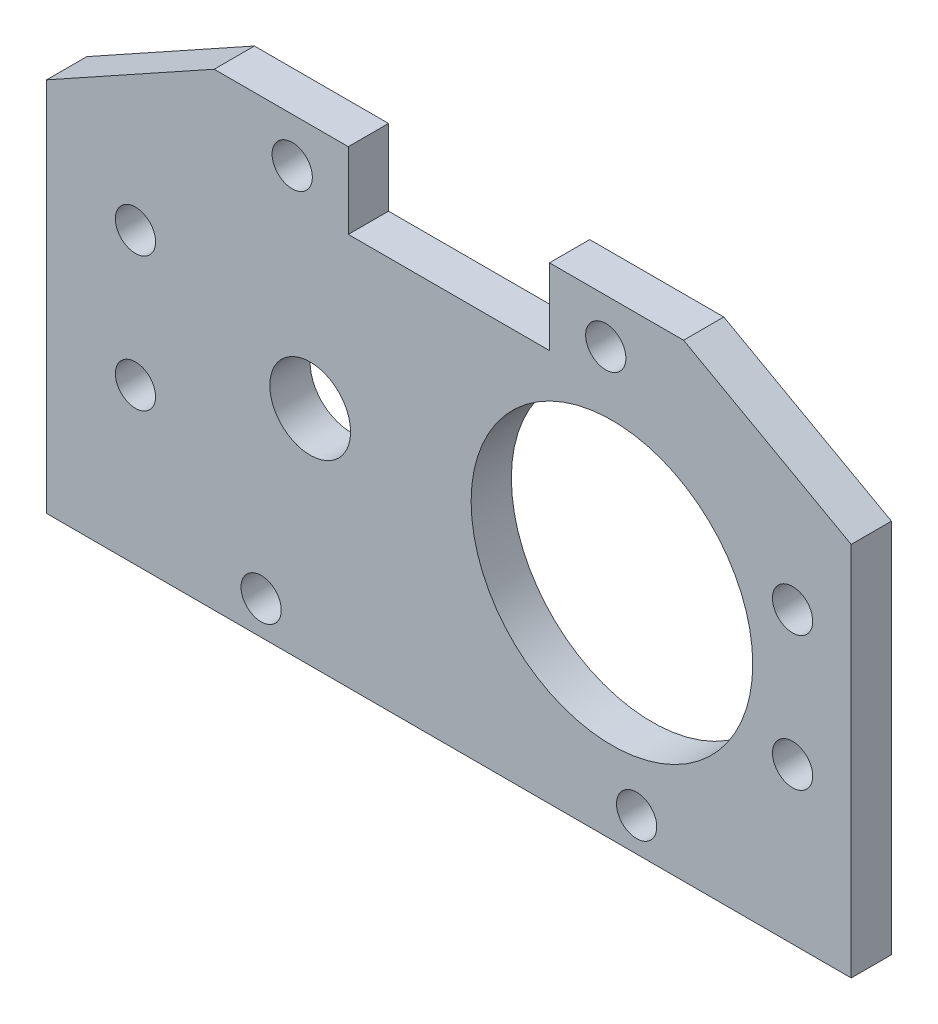
ISO-10303-21;
HEADER;
FILE_DESCRIPTION(('STEP AP214'),'2;1');
FILE_NAME('part.step','',(''),(''),'','','');
FILE_SCHEMA(('AUTOMOTIVE_DESIGN { 1 0 10303 214 1 1 1 1 }'));
ENDSEC;
DATA;
#1=APPLICATION_CONTEXT('core data for automotive mechanical design processes');
#2=APPLICATION_PROTOCOL_DEFINITION('international standard','automotive_design',2000,#1);
#3=PRODUCT_CONTEXT('',#1,'mechanical');
#4=PRODUCT('Part','Part','',(#3));
#5=PRODUCT_RELATED_PRODUCT_CATEGORY('part','',(#4));
#6=PRODUCT_DEFINITION_FORMATION('','',#4);
#7=PRODUCT_DEFINITION_CONTEXT('part definition',#1,'design');
#8=PRODUCT_DEFINITION('design','',#6,#7);
#9=PRODUCT_DEFINITION_SHAPE('','',#8);
#10=(LENGTH_UNIT() NAMED_UNIT(*) SI_UNIT(.MILLI.,.METRE.));
#11=(NAMED_UNIT(*) PLANE_ANGLE_UNIT() SI_UNIT($,.RADIAN.));
#12=(NAMED_UNIT(*) SI_UNIT($,.STERADIAN.) SOLID_ANGLE_UNIT());
#13=UNCERTAINTY_MEASURE_WITH_UNIT(LENGTH_MEASURE(1.E-05),#10,'distance_accuracy_value','');
#14=(GEOMETRIC_REPRESENTATION_CONTEXT(3) GLOBAL_UNCERTAINTY_ASSIGNED_CONTEXT((#13)) GLOBAL_UNIT_ASSIGNED_CONTEXT((#10,
#11,#12)) REPRESENTATION_CONTEXT('',''));
#15=CARTESIAN_POINT('',(0.,0.,0.));
#16=DIRECTION('',(0.,0.,1.));
#17=DIRECTION('',(1.,0.,0.));
#18=AXIS2_PLACEMENT_3D('',#15,#16,#17);
#19=CARTESIAN_POINT('',(7.5,0.,3.));
#20=DIRECTION('',(1.,0.,0.));
#21=DIRECTION('',(0.,0.,-1.));
#22=AXIS2_PLACEMENT_3D('',#19,#20,#21);
#23=PLANE('',#22);
#24=DIRECTION('',(0.,-1.,0.));
#25=VECTOR('',#24,1.);
#26=CARTESIAN_POINT('',(7.5,0.,0.));
#27=LINE('',#26,#25);
#28=CARTESIAN_POINT('',(7.5,5.66583768810425,0.));
#29=VERTEX_POINT('',#28);
#30=CARTESIAN_POINT('',(7.5,0.,0.));
#31=VERTEX_POINT('',#30);
#32=EDGE_CURVE('E142',#29,#31,#27,.T.);
#33=ORIENTED_EDGE('',*,*,#32,.T.);
#34=DIRECTION('',(0.,0.,-1.));
#35=VECTOR('',#34,1.);
#36=CARTESIAN_POINT('',(7.5,0.,3.));
#37=LINE('',#36,#35);
#38=CARTESIAN_POINT('',(7.5,0.,3.));
#39=VERTEX_POINT('',#38);
#40=EDGE_CURVE('E11',#39,#31,#37,.T.);
#41=ORIENTED_EDGE('',*,*,#40,.F.);
#42=DIRECTION('',(0.,-1.,0.));
#43=VECTOR('',#42,1.);
#44=CARTESIAN_POINT('',(7.5,0.,3.));
#45=LINE('',#44,#43);
#46=CARTESIAN_POINT('',(7.5,5.66583768810425,3.));
#47=VERTEX_POINT('',#46);
#48=EDGE_CURVE('E161',#47,#39,#45,.T.);
#49=ORIENTED_EDGE('',*,*,#48,.F.);
#50=DIRECTION('',(0.,0.,-1.));
#51=VECTOR('',#50,1.);
#52=CARTESIAN_POINT('',(7.5,5.66583768810425,3.));
#53=LINE('',#52,#51);
#54=EDGE_CURVE('E138',#47,#29,#53,.T.);
#55=ORIENTED_EDGE('',*,*,#54,.T.);
#56=EDGE_LOOP('',(#33,#41,#49,#55));
#57=FACE_BOUND('',#56,.T.);
#58=ADVANCED_FACE('F34',(#57),#23,.F.);
#59=CARTESIAN_POINT('',(-7.5,0.,3.));
#60=DIRECTION('',(0.,-1.,0.));
#61=DIRECTION('',(0.,0.,-1.));
#62=AXIS2_PLACEMENT_3D('',#59,#60,#61);
#63=PLANE('',#62);
#64=DIRECTION('',(-1.,0.,0.));
#65=VECTOR('',#64,1.);
#66=CARTESIAN_POINT('',(-7.5,0.,0.));
#67=LINE('',#66,#65);
#68=CARTESIAN_POINT('',(-7.5,0.,0.));
#69=VERTEX_POINT('',#68);
#70=EDGE_CURVE('E145',#31,#69,#67,.T.);
#71=ORIENTED_EDGE('',*,*,#70,.T.);
#72=DIRECTION('',(0.,0.,-1.));
#73=VECTOR('',#72,1.);
#74=CARTESIAN_POINT('',(-7.5,0.,3.));
#75=LINE('',#74,#73);
#76=CARTESIAN_POINT('',(-7.5,0.,3.));
#77=VERTEX_POINT('',#76);
#78=EDGE_CURVE('E42',#77,#69,#75,.T.);
#79=ORIENTED_EDGE('',*,*,#78,.F.);
#80=DIRECTION('',(-1.,0.,0.));
#81=VECTOR('',#80,1.);
#82=CARTESIAN_POINT('',(-7.5,0.,3.));
#83=LINE('',#82,#81);
#84=EDGE_CURVE('E99',#39,#77,#83,.T.);
#85=ORIENTED_EDGE('',*,*,#84,.F.);
#86=ORIENTED_EDGE('',*,*,#40,.T.);
#87=EDGE_LOOP('',(#71,#79,#85,#86));
#88=FACE_BOUND('',#87,.T.);
#89=ADVANCED_FACE('F314',(#88),#63,.F.);
#90=CARTESIAN_POINT('',(-7.5,0.,3.));
#91=DIRECTION('',(-1.,0.,0.));
#92=DIRECTION('',(0.,0.,1.));
#93=AXIS2_PLACEMENT_3D('',#90,#91,#92);
#94=PLANE('',#93);
#95=DIRECTION('',(0.,1.,0.));
#96=VECTOR('',#95,1.);
#97=CARTESIAN_POINT('',(-7.5,0.,0.));
#98=LINE('',#97,#96);
#99=CARTESIAN_POINT('',(-7.5,5.66583768810425,0.));
#100=VERTEX_POINT('',#99);
#101=EDGE_CURVE('E148',#69,#100,#98,.T.);
#102=ORIENTED_EDGE('',*,*,#101,.T.);
#103=DIRECTION('',(0.,0.,-1.));
#104=VECTOR('',#103,1.);
#105=CARTESIAN_POINT('',(-7.5,5.66583768810425,3.));
#106=LINE('',#105,#104);
#107=CARTESIAN_POINT('',(-7.5,5.66583768810425,3.));
#108=VERTEX_POINT('',#107);
#109=EDGE_CURVE('E174',#108,#100,#106,.T.);
#110=ORIENTED_EDGE('',*,*,#109,.F.);
#111=DIRECTION('',(0.,1.,0.));
#112=VECTOR('',#111,1.);
#113=CARTESIAN_POINT('',(-7.5,0.,3.));
#114=LINE('',#113,#112);
#115=EDGE_CURVE('E182',#77,#108,#114,.T.);
#116=ORIENTED_EDGE('',*,*,#115,.F.);
#117=ORIENTED_EDGE('',*,*,#78,.T.);
#118=EDGE_LOOP('',(#102,#110,#116,#117));
#119=FACE_BOUND('',#118,.T.);
#120=ADVANCED_FACE('F180',(#119),#94,.F.);
#121=CARTESIAN_POINT('',(-7.5,5.66583768810425,3.));
#122=DIRECTION('',(0.,-1.,0.));
#123=DIRECTION('',(1.,0.,0.));
#124=AXIS2_PLACEMENT_3D('',#121,#122,#123);
#125=PLANE('',#124);
#126=DIRECTION('',(-1.,0.,0.));
#127=VECTOR('',#126,1.);
#128=CARTESIAN_POINT('',(-7.5,5.66583768810425,0.));
#129=LINE('',#128,#127);
#130=CARTESIAN_POINT('',(-17.5,5.66583768810424,0.));
#131=VERTEX_POINT('',#130);
#132=EDGE_CURVE('E150',#100,#131,#129,.T.);
#133=ORIENTED_EDGE('',*,*,#132,.T.);
#134=DIRECTION('',(0.,0.,-1.));
#135=VECTOR('',#134,1.);
#136=CARTESIAN_POINT('',(-17.5,5.66583768810424,3.));
#137=LINE('',#136,#135);
#138=CARTESIAN_POINT('',(-17.5,5.66583768810424,3.));
#139=VERTEX_POINT('',#138);
#140=EDGE_CURVE('E171',#139,#131,#137,.T.);
#141=ORIENTED_EDGE('',*,*,#140,.F.);
#142=DIRECTION('',(-1.,0.,0.));
#143=VECTOR('',#142,1.);
#144=CARTESIAN_POINT('',(-7.5,5.66583768810425,3.));
#145=LINE('',#144,#143);
#146=EDGE_CURVE('E200',#108,#139,#145,.T.);
#147=ORIENTED_EDGE('',*,*,#146,.F.);
#148=ORIENTED_EDGE('',*,*,#109,.T.);
#149=EDGE_LOOP('',(#133,#141,#147,#148));
#150=FACE_BOUND('',#149,.T.);
#151=ADVANCED_FACE('F191',(#150),#125,.F.);
#152=CARTESIAN_POINT('',(-17.5,5.66583768810424,3.));
#153=DIRECTION('',(0.485146223738787,-0.874433040084828,0.));
#154=DIRECTION('',(0.874433040084828,0.485146223738787,0.));
#155=AXIS2_PLACEMENT_3D('',#152,#153,#154);
#156=PLANE('',#155);
#157=DIRECTION('',(-0.874433040084828,-0.485146223738787,0.));
#158=VECTOR('',#157,1.);
#159=CARTESIAN_POINT('',(-17.5,5.66583768810424,0.));
#160=LINE('',#159,#158);
#161=CARTESIAN_POINT('',(-30.,-1.26931631310612,0.));
#162=VERTEX_POINT('',#161);
#163=EDGE_CURVE('E152',#131,#162,#160,.T.);
#164=ORIENTED_EDGE('',*,*,#163,.T.);
#165=DIRECTION('',(0.,0.,-1.));
#166=VECTOR('',#165,1.);
#167=CARTESIAN_POINT('',(-30.,-1.26931631310612,3.));
#168=LINE('',#167,#166);
#169=CARTESIAN_POINT('',(-30.,-1.26931631310612,3.));
#170=VERTEX_POINT('',#169);
#171=EDGE_CURVE('E168',#170,#162,#168,.T.);
#172=ORIENTED_EDGE('',*,*,#171,.F.);
#173=DIRECTION('',(-0.874433040084828,-0.485146223738787,0.));
#174=VECTOR('',#173,1.);
#175=CARTESIAN_POINT('',(-17.5,5.66583768810424,3.));
#176=LINE('',#175,#174);
#177=EDGE_CURVE('E197',#139,#170,#176,.T.);
#178=ORIENTED_EDGE('',*,*,#177,.F.);
#179=ORIENTED_EDGE('',*,*,#140,.T.);
#180=EDGE_LOOP('',(#164,#172,#178,#179));
#181=FACE_BOUND('',#180,.T.);
#182=ADVANCED_FACE('F195',(#181),#156,.F.);
#183=CARTESIAN_POINT('',(-30.,-1.26931631310612,3.));
#184=DIRECTION('',(1.,0.,0.));
#185=DIRECTION('',(0.,1.,0.));
#186=AXIS2_PLACEMENT_3D('',#183,#184,#185);
#187=PLANE('',#186);
#188=DIRECTION('',(0.,-1.,0.));
#189=VECTOR('',#188,1.);
#190=CARTESIAN_POINT('',(-30.,-1.26931631310612,0.));
#191=LINE('',#190,#189);
#192=CARTESIAN_POINT('',(-30.,-29.2693163131061,0.));
#193=VERTEX_POINT('',#192);
#194=EDGE_CURVE('E154',#162,#193,#191,.T.);
#195=ORIENTED_EDGE('',*,*,#194,.T.);
#196=DIRECTION('',(0.,0.,-1.));
#197=VECTOR('',#196,1.);
#198=CARTESIAN_POINT('',(-30.,-29.2693163131061,3.));
#199=LINE('',#198,#197);
#200=CARTESIAN_POINT('',(-30.,-29.2693163131061,3.));
#201=VERTEX_POINT('',#200);
#202=EDGE_CURVE('E165',#201,#193,#199,.T.);
#203=ORIENTED_EDGE('',*,*,#202,.F.);
#204=DIRECTION('',(0.,-1.,0.));
#205=VECTOR('',#204,1.);
#206=CARTESIAN_POINT('',(-30.,-1.26931631310612,3.));
#207=LINE('',#206,#205);
#208=EDGE_CURVE('E199',#170,#201,#207,.T.);
#209=ORIENTED_EDGE('',*,*,#208,.F.);
#210=ORIENTED_EDGE('',*,*,#171,.T.);
#211=EDGE_LOOP('',(#195,#203,#209,#210));
#212=FACE_BOUND('',#211,.T.);
#213=ADVANCED_FACE('F326',(#212),#187,.F.);
#214=CARTESIAN_POINT('',(30.,-29.2693163131061,3.));
#215=DIRECTION('',(0.,1.,0.));
#216=DIRECTION('',(-1.,0.,0.));
#217=AXIS2_PLACEMENT_3D('',#214,#215,#216);
#218=PLANE('',#217);
#219=DIRECTION('',(1.,0.,0.));
#220=VECTOR('',#219,1.);
#221=CARTESIAN_POINT('',(30.,-29.2693163131061,0.));
#222=LINE('',#221,#220);
#223=CARTESIAN_POINT('',(30.,-29.2693163131061,0.));
#224=VERTEX_POINT('',#223);
#225=EDGE_CURVE('E156',#193,#224,#222,.T.);
#226=ORIENTED_EDGE('',*,*,#225,.T.);
#227=DIRECTION('',(0.,0.,-1.));
#228=VECTOR('',#227,1.);
#229=CARTESIAN_POINT('',(30.,-29.2693163131061,3.));
#230=LINE('',#229,#228);
#231=CARTESIAN_POINT('',(30.,-29.2693163131061,3.));
#232=VERTEX_POINT('',#231);
#233=EDGE_CURVE('E133',#232,#224,#230,.T.);
#234=ORIENTED_EDGE('',*,*,#233,.F.);
#235=DIRECTION('',(1.,0.,0.));
#236=VECTOR('',#235,1.);
#237=CARTESIAN_POINT('',(30.,-29.2693163131061,3.));
#238=LINE('',#237,#236);
#239=EDGE_CURVE('E124',#201,#232,#238,.T.);
#240=ORIENTED_EDGE('',*,*,#239,.F.);
#241=ORIENTED_EDGE('',*,*,#202,.T.);
#242=EDGE_LOOP('',(#226,#234,#240,#241));
#243=FACE_BOUND('',#242,.T.);
#244=ADVANCED_FACE('F323',(#243),#218,.F.);
#245=CARTESIAN_POINT('',(30.,-1.26931631310611,3.));
#246=DIRECTION('',(-1.,0.,0.));
#247=DIRECTION('',(0.,-1.,0.));
#248=AXIS2_PLACEMENT_3D('',#245,#246,#247);
#249=PLANE('',#248);
#250=DIRECTION('',(0.,1.,0.));
#251=VECTOR('',#250,1.);
#252=CARTESIAN_POINT('',(30.,-1.26931631310611,0.));
#253=LINE('',#252,#251);
#254=CARTESIAN_POINT('',(30.,-1.26931631310611,0.));
#255=VERTEX_POINT('',#254);
#256=EDGE_CURVE('E132',#224,#255,#253,.T.);
#257=ORIENTED_EDGE('',*,*,#256,.T.);
#258=DIRECTION('',(0.,0.,-1.));
#259=VECTOR('',#258,1.);
#260=CARTESIAN_POINT('',(30.,-1.26931631310611,3.));
#261=LINE('',#260,#259);
#262=CARTESIAN_POINT('',(30.,-1.26931631310611,3.));
#263=VERTEX_POINT('',#262);
#264=EDGE_CURVE('E129',#263,#255,#261,.T.);
#265=ORIENTED_EDGE('',*,*,#264,.F.);
#266=DIRECTION('',(0.,1.,0.));
#267=VECTOR('',#266,1.);
#268=CARTESIAN_POINT('',(30.,-1.26931631310611,3.));
#269=LINE('',#268,#267);
#270=EDGE_CURVE('E118',#232,#263,#269,.T.);
#271=ORIENTED_EDGE('',*,*,#270,.F.);
#272=ORIENTED_EDGE('',*,*,#233,.T.);
#273=EDGE_LOOP('',(#257,#265,#271,#272));
#274=FACE_BOUND('',#273,.T.);
#275=ADVANCED_FACE('F130',(#274),#249,.F.);
#276=CARTESIAN_POINT('',(17.5,5.66583768810425,3.));
#277=DIRECTION('',(-0.485146223738787,-0.874433040084828,0.));
#278=DIRECTION('',(0.874433040084828,-0.485146223738787,0.));
#279=AXIS2_PLACEMENT_3D('',#276,#277,#278);
#280=PLANE('',#279);
#281=DIRECTION('',(-0.874433040084828,0.485146223738787,0.));
#282=VECTOR('',#281,1.);
#283=CARTESIAN_POINT('',(17.5,5.66583768810425,0.));
#284=LINE('',#283,#282);
#285=CARTESIAN_POINT('',(17.5,5.66583768810425,0.));
#286=VERTEX_POINT('',#285);
#287=EDGE_CURVE('E85',#255,#286,#284,.T.);
#288=ORIENTED_EDGE('',*,*,#287,.T.);
#289=DIRECTION('',(0.,0.,-1.));
#290=VECTOR('',#289,1.);
#291=CARTESIAN_POINT('',(17.5,5.66583768810425,3.));
#292=LINE('',#291,#290);
#293=CARTESIAN_POINT('',(17.5,5.66583768810425,3.));
#294=VERTEX_POINT('',#293);
#295=EDGE_CURVE('E134',#294,#286,#292,.T.);
#296=ORIENTED_EDGE('',*,*,#295,.F.);
#297=DIRECTION('',(-0.874433040084828,0.485146223738787,0.));
#298=VECTOR('',#297,1.);
#299=CARTESIAN_POINT('',(17.5,5.66583768810425,3.));
#300=LINE('',#299,#298);
#301=EDGE_CURVE('E122',#263,#294,#300,.T.);
#302=ORIENTED_EDGE('',*,*,#301,.F.);
#303=ORIENTED_EDGE('',*,*,#264,.T.);
#304=EDGE_LOOP('',(#288,#296,#302,#303));
#305=FACE_BOUND('',#304,.T.);
#306=ADVANCED_FACE('F136',(#305),#280,.F.);
#307=CARTESIAN_POINT('',(7.5,5.66583768810425,3.));
#308=DIRECTION('',(0.,-1.,0.));
#309=DIRECTION('',(0.,0.,-1.));
#310=AXIS2_PLACEMENT_3D('',#307,#308,#309);
#311=PLANE('',#310);
#312=DIRECTION('',(-1.,0.,0.));
#313=VECTOR('',#312,1.);
#314=CARTESIAN_POINT('',(7.5,5.66583768810425,0.));
#315=LINE('',#314,#313);
#316=EDGE_CURVE('E91',#286,#29,#315,.T.);
#317=ORIENTED_EDGE('',*,*,#316,.T.);
#318=ORIENTED_EDGE('',*,*,#54,.F.);
#319=DIRECTION('',(-1.,0.,0.));
#320=VECTOR('',#319,1.);
#321=CARTESIAN_POINT('',(7.5,5.66583768810425,3.));
#322=LINE('',#321,#320);
#323=EDGE_CURVE('E50',#294,#47,#322,.T.);
#324=ORIENTED_EDGE('',*,*,#323,.F.);
#325=ORIENTED_EDGE('',*,*,#295,.T.);
#326=EDGE_LOOP('',(#317,#318,#324,#325));
#327=FACE_BOUND('',#326,.T.);
#328=ADVANCED_FACE('F378',(#327),#311,.F.);
#329=CARTESIAN_POINT('',(0.,0.,3.));
#330=DIRECTION('',(0.,0.,-1.));
#331=DIRECTION('',(-1.,0.,0.));
#332=AXIS2_PLACEMENT_3D('',#329,#330,#331);
#333=PLANE('',#332);
#334=CARTESIAN_POINT('',(-14.,-26.7693163131062,3.));
#335=DIRECTION('',(0.,0.,-1.));
#336=DIRECTION('',(-1.,0.,0.));
#337=AXIS2_PLACEMENT_3D('',#334,#335,#336);
#338=CIRCLE('',#337,1.49999999999999);
#339=CARTESIAN_POINT('',(-15.5,-26.7693163131062,3.));
#340=VERTEX_POINT('',#339);
#341=EDGE_CURVE('E248',#340,#340,#338,.T.);
#342=ORIENTED_EDGE('',*,*,#341,.T.);
#343=EDGE_LOOP('',(#342));
#344=FACE_BOUND('',#343,.T.);
#345=CARTESIAN_POINT('',(14.,-26.7693163131061,3.));
#346=DIRECTION('',(0.,0.,-1.));
#347=DIRECTION('',(-1.,0.,0.));
#348=AXIS2_PLACEMENT_3D('',#345,#346,#347);
#349=CIRCLE('',#348,1.5);
#350=CARTESIAN_POINT('',(12.5,-26.7693163131061,3.));
#351=VERTEX_POINT('',#350);
#352=EDGE_CURVE('E259',#351,#351,#349,.T.);
#353=ORIENTED_EDGE('',*,*,#352,.T.);
#354=EDGE_LOOP('',(#353));
#355=FACE_BOUND('',#354,.T.);
#356=CARTESIAN_POINT('',(12.1584471796846,-12.6693801884366,3.));
#357=DIRECTION('',(0.,0.,-1.));
#358=DIRECTION('',(-1.,0.,0.));
#359=AXIS2_PLACEMENT_3D('',#356,#357,#358);
#360=CIRCLE('',#359,10.5);
#361=CARTESIAN_POINT('',(1.65844717968459,-12.6693801884366,3.));
#362=VERTEX_POINT('',#361);
#363=EDGE_CURVE('E236',#362,#362,#360,.T.);
#364=ORIENTED_EDGE('',*,*,#363,.T.);
#365=EDGE_LOOP('',(#364));
#366=FACE_BOUND('',#365,.T.);
#367=CARTESIAN_POINT('',(-10.3415528202247,-12.6693163131061,3.));
#368=DIRECTION('',(0.,0.,-1.));
#369=DIRECTION('',(-1.,0.,0.));
#370=AXIS2_PLACEMENT_3D('',#367,#368,#369);
#371=CIRCLE('',#370,3.01000000000002);
#372=CARTESIAN_POINT('',(-13.3515528202248,-12.6693163131061,3.));
#373=VERTEX_POINT('',#372);
#374=EDGE_CURVE('E247',#373,#373,#371,.T.);
#375=ORIENTED_EDGE('',*,*,#374,.T.);
#376=EDGE_LOOP('',(#375));
#377=FACE_BOUND('',#376,.T.);
#378=CARTESIAN_POINT('',(11.6968329642972,2.35034329740187,3.));
#379=DIRECTION('',(0.,0.,-1.));
#380=DIRECTION('',(-1.,0.,0.));
#381=AXIS2_PLACEMENT_3D('',#378,#379,#380);
#382=CIRCLE('',#381,1.5);
#383=CARTESIAN_POINT('',(10.1968329642972,2.35034329740187,3.));
#384=VERTEX_POINT('',#383);
#385=EDGE_CURVE('E229',#384,#384,#382,.T.);
#386=ORIENTED_EDGE('',*,*,#385,.T.);
#387=EDGE_LOOP('',(#386));
#388=FACE_BOUND('',#387,.T.);
#389=CARTESIAN_POINT('',(-11.6821646357028,2.35034329740185,3.));
#390=DIRECTION('',(0.,0.,-1.));
#391=DIRECTION('',(-1.,0.,0.));
#392=AXIS2_PLACEMENT_3D('',#389,#390,#391);
#393=CIRCLE('',#392,1.5);
#394=CARTESIAN_POINT('',(-13.1821646357028,2.35034329740185,3.));
#395=VERTEX_POINT('',#394);
#396=EDGE_CURVE('E235',#395,#395,#393,.T.);
#397=ORIENTED_EDGE('',*,*,#396,.T.);
#398=EDGE_LOOP('',(#397));
#399=FACE_BOUND('',#398,.T.);
#400=CARTESIAN_POINT('',(25.6284471796846,-7.66938018843653,3.));
#401=DIRECTION('',(0.,0.,-1.));
#402=DIRECTION('',(-1.,0.,0.));
#403=AXIS2_PLACEMENT_3D('',#400,#401,#402);
#404=CIRCLE('',#403,1.5);
#405=CARTESIAN_POINT('',(24.1284471796846,-7.66938018843653,3.));
#406=VERTEX_POINT('',#405);
#407=EDGE_CURVE('E211',#406,#406,#404,.T.);
#408=ORIENTED_EDGE('',*,*,#407,.T.);
#409=EDGE_LOOP('',(#408));
#410=FACE_BOUND('',#409,.T.);
#411=CARTESIAN_POINT('',(-23.3715528203154,-17.6693801884365,3.));
#412=DIRECTION('',(0.,0.,-1.));
#413=DIRECTION('',(-1.,0.,0.));
#414=AXIS2_PLACEMENT_3D('',#411,#412,#413);
#415=CIRCLE('',#414,1.5);
#416=CARTESIAN_POINT('',(-24.8715528203154,-17.6693801884365,3.));
#417=VERTEX_POINT('',#416);
#418=EDGE_CURVE('E217',#417,#417,#415,.T.);
#419=ORIENTED_EDGE('',*,*,#418,.T.);
#420=EDGE_LOOP('',(#419));
#421=FACE_BOUND('',#420,.T.);
#422=CARTESIAN_POINT('',(-23.3715528203154,-7.66938018843654,3.));
#423=DIRECTION('',(0.,0.,-1.));
#424=DIRECTION('',(-1.,0.,0.));
#425=AXIS2_PLACEMENT_3D('',#422,#423,#424);
#426=CIRCLE('',#425,1.5);
#427=CARTESIAN_POINT('',(-24.8715528203154,-7.66938018843654,3.));
#428=VERTEX_POINT('',#427);
#429=EDGE_CURVE('E218',#428,#428,#426,.T.);
#430=ORIENTED_EDGE('',*,*,#429,.T.);
#431=EDGE_LOOP('',(#430));
#432=FACE_BOUND('',#431,.T.);
#433=CARTESIAN_POINT('',(25.6284471796846,-17.6693801884365,3.));
#434=DIRECTION('',(0.,0.,-1.));
#435=DIRECTION('',(-1.,0.,0.));
#436=AXIS2_PLACEMENT_3D('',#433,#434,#435);
#437=CIRCLE('',#436,1.5);
#438=CARTESIAN_POINT('',(24.1284471796846,-17.6693801884365,3.));
#439=VERTEX_POINT('',#438);
#440=EDGE_CURVE('E146',#439,#439,#437,.T.);
#441=ORIENTED_EDGE('',*,*,#440,.T.);
#442=EDGE_LOOP('',(#441));
#443=FACE_BOUND('',#442,.T.);
#444=ORIENTED_EDGE('',*,*,#48,.T.);
#445=ORIENTED_EDGE('',*,*,#84,.T.);
#446=ORIENTED_EDGE('',*,*,#115,.T.);
#447=ORIENTED_EDGE('',*,*,#146,.T.);
#448=ORIENTED_EDGE('',*,*,#177,.T.);
#449=ORIENTED_EDGE('',*,*,#208,.T.);
#450=ORIENTED_EDGE('',*,*,#239,.T.);
#451=ORIENTED_EDGE('',*,*,#270,.T.);
#452=ORIENTED_EDGE('',*,*,#301,.T.);
#453=ORIENTED_EDGE('',*,*,#323,.T.);
#454=EDGE_LOOP('',(#444,#445,#446,#447,#448,#449,#450,#451,#452,#453));
#455=FACE_BOUND('',#454,.T.);
#456=ADVANCED_FACE('F120',(#344,#355,#366,#377,#388,#399,#410,#421,#432,#443,#455),#333,.F.);
#457=CARTESIAN_POINT('',(0.,0.,0.));
#458=DIRECTION('',(0.,0.,-1.));
#459=DIRECTION('',(-1.,0.,0.));
#460=AXIS2_PLACEMENT_3D('',#457,#458,#459);
#461=PLANE('',#460);
#462=CARTESIAN_POINT('',(-14.,-26.7693163131062,0.));
#463=DIRECTION('',(0.,0.,-1.));
#464=DIRECTION('',(-1.,0.,0.));
#465=AXIS2_PLACEMENT_3D('',#462,#463,#464);
#466=CIRCLE('',#465,1.49999999999999);
#467=CARTESIAN_POINT('',(-15.5,-26.7693163131062,0.));
#468=VERTEX_POINT('',#467);
#469=EDGE_CURVE('E262',#468,#468,#466,.T.);
#470=ORIENTED_EDGE('',*,*,#469,.F.);
#471=EDGE_LOOP('',(#470));
#472=FACE_BOUND('',#471,.T.);
#473=CARTESIAN_POINT('',(14.,-26.7693163131061,0.));
#474=DIRECTION('',(0.,0.,-1.));
#475=DIRECTION('',(-1.,0.,0.));
#476=AXIS2_PLACEMENT_3D('',#473,#474,#475);
#477=CIRCLE('',#476,1.5);
#478=CARTESIAN_POINT('',(12.5,-26.7693163131061,0.));
#479=VERTEX_POINT('',#478);
#480=EDGE_CURVE('E256',#479,#479,#477,.T.);
#481=ORIENTED_EDGE('',*,*,#480,.F.);
#482=EDGE_LOOP('',(#481));
#483=FACE_BOUND('',#482,.T.);
#484=CARTESIAN_POINT('',(12.1584471796846,-12.6693801884366,0.));
#485=DIRECTION('',(0.,0.,-1.));
#486=DIRECTION('',(-1.,0.,0.));
#487=AXIS2_PLACEMENT_3D('',#484,#485,#486);
#488=CIRCLE('',#487,10.5);
#489=CARTESIAN_POINT('',(1.65844717968459,-12.6693801884366,0.));
#490=VERTEX_POINT('',#489);
#491=EDGE_CURVE('E251',#490,#490,#488,.T.);
#492=ORIENTED_EDGE('',*,*,#491,.F.);
#493=EDGE_LOOP('',(#492));
#494=FACE_BOUND('',#493,.T.);
#495=CARTESIAN_POINT('',(-10.3415528202247,-12.6693163131061,0.));
#496=DIRECTION('',(0.,0.,-1.));
#497=DIRECTION('',(-1.,0.,0.));
#498=AXIS2_PLACEMENT_3D('',#495,#496,#497);
#499=CIRCLE('',#498,3.01000000000002);
#500=CARTESIAN_POINT('',(-13.3515528202248,-12.6693163131061,0.));
#501=VERTEX_POINT('',#500);
#502=EDGE_CURVE('E244',#501,#501,#499,.T.);
#503=ORIENTED_EDGE('',*,*,#502,.F.);
#504=EDGE_LOOP('',(#503));
#505=FACE_BOUND('',#504,.T.);
#506=CARTESIAN_POINT('',(11.6968329642972,2.35034329740187,0.));
#507=DIRECTION('',(0.,0.,-1.));
#508=DIRECTION('',(-1.,0.,0.));
#509=AXIS2_PLACEMENT_3D('',#506,#507,#508);
#510=CIRCLE('',#509,1.5);
#511=CARTESIAN_POINT('',(10.1968329642972,2.35034329740187,0.));
#512=VERTEX_POINT('',#511);
#513=EDGE_CURVE('E239',#512,#512,#510,.T.);
#514=ORIENTED_EDGE('',*,*,#513,.F.);
#515=EDGE_LOOP('',(#514));
#516=FACE_BOUND('',#515,.T.);
#517=CARTESIAN_POINT('',(-11.6821646357028,2.35034329740185,0.));
#518=DIRECTION('',(0.,0.,-1.));
#519=DIRECTION('',(-1.,0.,0.));
#520=AXIS2_PLACEMENT_3D('',#517,#518,#519);
#521=CIRCLE('',#520,1.5);
#522=CARTESIAN_POINT('',(-13.1821646357028,2.35034329740185,0.));
#523=VERTEX_POINT('',#522);
#524=EDGE_CURVE('E232',#523,#523,#521,.T.);
#525=ORIENTED_EDGE('',*,*,#524,.F.);
#526=EDGE_LOOP('',(#525));
#527=FACE_BOUND('',#526,.T.);
#528=CARTESIAN_POINT('',(25.6284471796846,-7.66938018843653,0.));
#529=DIRECTION('',(0.,0.,-1.));
#530=DIRECTION('',(-1.,0.,0.));
#531=AXIS2_PLACEMENT_3D('',#528,#529,#530);
#532=CIRCLE('',#531,1.5);
#533=CARTESIAN_POINT('',(24.1284471796846,-7.66938018843653,0.));
#534=VERTEX_POINT('',#533);
#535=EDGE_CURVE('E221',#534,#534,#532,.T.);
#536=ORIENTED_EDGE('',*,*,#535,.F.);
#537=EDGE_LOOP('',(#536));
#538=FACE_BOUND('',#537,.T.);
#539=CARTESIAN_POINT('',(-23.3715528203154,-17.6693801884365,0.));
#540=DIRECTION('',(0.,0.,-1.));
#541=DIRECTION('',(-1.,0.,0.));
#542=AXIS2_PLACEMENT_3D('',#539,#540,#541);
#543=CIRCLE('',#542,1.5);
#544=CARTESIAN_POINT('',(-24.8715528203154,-17.6693801884365,0.));
#545=VERTEX_POINT('',#544);
#546=EDGE_CURVE('E214',#545,#545,#543,.T.);
#547=ORIENTED_EDGE('',*,*,#546,.F.);
#548=EDGE_LOOP('',(#547));
#549=FACE_BOUND('',#548,.T.);
#550=CARTESIAN_POINT('',(-23.3715528203154,-7.66938018843654,0.));
#551=DIRECTION('',(0.,0.,-1.));
#552=DIRECTION('',(-1.,0.,0.));
#553=AXIS2_PLACEMENT_3D('',#550,#551,#552);
#554=CIRCLE('',#553,1.5);
#555=CARTESIAN_POINT('',(-24.8715528203154,-7.66938018843654,0.));
#556=VERTEX_POINT('',#555);
#557=EDGE_CURVE('E226',#556,#556,#554,.T.);
#558=ORIENTED_EDGE('',*,*,#557,.F.);
#559=EDGE_LOOP('',(#558));
#560=FACE_BOUND('',#559,.T.);
#561=CARTESIAN_POINT('',(25.6284471796846,-17.6693801884365,0.));
#562=DIRECTION('',(0.,0.,-1.));
#563=DIRECTION('',(-1.,0.,0.));
#564=AXIS2_PLACEMENT_3D('',#561,#562,#563);
#565=CIRCLE('',#564,1.5);
#566=CARTESIAN_POINT('',(24.1284471796846,-17.6693801884365,0.));
#567=VERTEX_POINT('',#566);
#568=EDGE_CURVE('E208',#567,#567,#565,.T.);
#569=ORIENTED_EDGE('',*,*,#568,.F.);
#570=EDGE_LOOP('',(#569));
#571=FACE_BOUND('',#570,.T.);
#572=ORIENTED_EDGE('',*,*,#32,.F.);
#573=ORIENTED_EDGE('',*,*,#316,.F.);
#574=ORIENTED_EDGE('',*,*,#287,.F.);
#575=ORIENTED_EDGE('',*,*,#256,.F.);
#576=ORIENTED_EDGE('',*,*,#225,.F.);
#577=ORIENTED_EDGE('',*,*,#194,.F.);
#578=ORIENTED_EDGE('',*,*,#163,.F.);
#579=ORIENTED_EDGE('',*,*,#132,.F.);
#580=ORIENTED_EDGE('',*,*,#101,.F.);
#581=ORIENTED_EDGE('',*,*,#70,.F.);
#582=EDGE_LOOP('',(#572,#573,#574,#575,#576,#577,#578,#579,#580,#581));
#583=FACE_BOUND('',#582,.T.);
#584=ADVANCED_FACE('F186',(#472,#483,#494,#505,#516,#527,#538,#549,#560,#571,#583),#461,.T.);
#585=CARTESIAN_POINT('',(25.6284471796846,-17.6693801884365,3.));
#586=DIRECTION('',(0.,0.,-1.));
#587=DIRECTION('',(-1.,0.,0.));
#588=AXIS2_PLACEMENT_3D('',#585,#586,#587);
#589=CYLINDRICAL_SURFACE('',#588,1.5);
#590=ORIENTED_EDGE('',*,*,#440,.F.);
#591=EDGE_LOOP('',(#590));
#592=FACE_BOUND('',#591,.T.);
#593=ORIENTED_EDGE('',*,*,#568,.T.);
#594=EDGE_LOOP('',(#593));
#595=FACE_BOUND('',#594,.T.);
#596=ADVANCED_FACE('F279',(#592,#595),#589,.F.);
#597=CARTESIAN_POINT('',(-23.3715528203154,-7.66938018843654,3.));
#598=DIRECTION('',(0.,0.,-1.));
#599=DIRECTION('',(-1.,0.,0.));
#600=AXIS2_PLACEMENT_3D('',#597,#598,#599);
#601=CYLINDRICAL_SURFACE('',#600,1.5);
#602=ORIENTED_EDGE('',*,*,#429,.F.);
#603=EDGE_LOOP('',(#602));
#604=FACE_BOUND('',#603,.T.);
#605=ORIENTED_EDGE('',*,*,#557,.T.);
#606=EDGE_LOOP('',(#605));
#607=FACE_BOUND('',#606,.T.);
#608=ADVANCED_FACE('F300',(#604,#607),#601,.F.);
#609=CARTESIAN_POINT('',(-23.3715528203154,-17.6693801884365,3.));
#610=DIRECTION('',(0.,0.,-1.));
#611=DIRECTION('',(-1.,0.,0.));
#612=AXIS2_PLACEMENT_3D('',#609,#610,#611);
#613=CYLINDRICAL_SURFACE('',#612,1.5);
#614=ORIENTED_EDGE('',*,*,#418,.F.);
#615=EDGE_LOOP('',(#614));
#616=FACE_BOUND('',#615,.T.);
#617=ORIENTED_EDGE('',*,*,#546,.T.);
#618=EDGE_LOOP('',(#617));
#619=FACE_BOUND('',#618,.T.);
#620=ADVANCED_FACE('F307',(#616,#619),#613,.F.);
#621=CARTESIAN_POINT('',(25.6284471796846,-7.66938018843653,3.));
#622=DIRECTION('',(0.,0.,-1.));
#623=DIRECTION('',(-1.,0.,0.));
#624=AXIS2_PLACEMENT_3D('',#621,#622,#623);
#625=CYLINDRICAL_SURFACE('',#624,1.5);
#626=ORIENTED_EDGE('',*,*,#407,.F.);
#627=EDGE_LOOP('',(#626));
#628=FACE_BOUND('',#627,.T.);
#629=ORIENTED_EDGE('',*,*,#535,.T.);
#630=EDGE_LOOP('',(#629));
#631=FACE_BOUND('',#630,.T.);
#632=ADVANCED_FACE('F408',(#628,#631),#625,.F.);
#633=CARTESIAN_POINT('',(-11.6821646357028,2.35034329740185,3.));
#634=DIRECTION('',(0.,0.,-1.));
#635=DIRECTION('',(-1.,0.,0.));
#636=AXIS2_PLACEMENT_3D('',#633,#634,#635);
#637=CYLINDRICAL_SURFACE('',#636,1.5);
#638=ORIENTED_EDGE('',*,*,#396,.F.);
#639=EDGE_LOOP('',(#638));
#640=FACE_BOUND('',#639,.T.);
#641=ORIENTED_EDGE('',*,*,#524,.T.);
#642=EDGE_LOOP('',(#641));
#643=FACE_BOUND('',#642,.T.);
#644=ADVANCED_FACE('F417',(#640,#643),#637,.F.);
#645=CARTESIAN_POINT('',(11.6968329642972,2.35034329740187,3.));
#646=DIRECTION('',(0.,0.,-1.));
#647=DIRECTION('',(-1.,0.,0.));
#648=AXIS2_PLACEMENT_3D('',#645,#646,#647);
#649=CYLINDRICAL_SURFACE('',#648,1.5);
#650=ORIENTED_EDGE('',*,*,#385,.F.);
#651=EDGE_LOOP('',(#650));
#652=FACE_BOUND('',#651,.T.);
#653=ORIENTED_EDGE('',*,*,#513,.T.);
#654=EDGE_LOOP('',(#653));
#655=FACE_BOUND('',#654,.T.);
#656=ADVANCED_FACE('F427',(#652,#655),#649,.F.);
#657=CARTESIAN_POINT('',(-10.3415528202247,-12.6693163131061,3.));
#658=DIRECTION('',(0.,0.,-1.));
#659=DIRECTION('',(-1.,0.,0.));
#660=AXIS2_PLACEMENT_3D('',#657,#658,#659);
#661=CYLINDRICAL_SURFACE('',#660,3.01000000000002);
#662=ORIENTED_EDGE('',*,*,#374,.F.);
#663=EDGE_LOOP('',(#662));
#664=FACE_BOUND('',#663,.T.);
#665=ORIENTED_EDGE('',*,*,#502,.T.);
#666=EDGE_LOOP('',(#665));
#667=FACE_BOUND('',#666,.T.);
#668=ADVANCED_FACE('F437',(#664,#667),#661,.F.);
#669=CARTESIAN_POINT('',(12.1584471796846,-12.6693801884366,3.));
#670=DIRECTION('',(0.,0.,-1.));
#671=DIRECTION('',(-1.,0.,0.));
#672=AXIS2_PLACEMENT_3D('',#669,#670,#671);
#673=CYLINDRICAL_SURFACE('',#672,10.5);
#674=ORIENTED_EDGE('',*,*,#363,.F.);
#675=EDGE_LOOP('',(#674));
#676=FACE_BOUND('',#675,.T.);
#677=ORIENTED_EDGE('',*,*,#491,.T.);
#678=EDGE_LOOP('',(#677));
#679=FACE_BOUND('',#678,.T.);
#680=ADVANCED_FACE('F447',(#676,#679),#673,.F.);
#681=CARTESIAN_POINT('',(14.,-26.7693163131061,3.));
#682=DIRECTION('',(0.,0.,-1.));
#683=DIRECTION('',(-1.,0.,0.));
#684=AXIS2_PLACEMENT_3D('',#681,#682,#683);
#685=CYLINDRICAL_SURFACE('',#684,1.5);
#686=ORIENTED_EDGE('',*,*,#352,.F.);
#687=EDGE_LOOP('',(#686));
#688=FACE_BOUND('',#687,.T.);
#689=ORIENTED_EDGE('',*,*,#480,.T.);
#690=EDGE_LOOP('',(#689));
#691=FACE_BOUND('',#690,.T.);
#692=ADVANCED_FACE('F273',(#688,#691),#685,.F.);
#693=CARTESIAN_POINT('',(-14.,-26.7693163131062,3.));
#694=DIRECTION('',(0.,0.,-1.));
#695=DIRECTION('',(-1.,0.,0.));
#696=AXIS2_PLACEMENT_3D('',#693,#694,#695);
#697=CYLINDRICAL_SURFACE('',#696,1.49999999999999);
#698=ORIENTED_EDGE('',*,*,#341,.F.);
#699=EDGE_LOOP('',(#698));
#700=FACE_BOUND('',#699,.T.);
#701=ORIENTED_EDGE('',*,*,#469,.T.);
#702=EDGE_LOOP('',(#701));
#703=FACE_BOUND('',#702,.T.);
#704=ADVANCED_FACE('F270',(#700,#703),#697,.F.);
#705=CLOSED_SHELL('',(#58,#89,#120,#151,#182,#213,#244,#275,#306,#328,#456,#584,#596,#608,#620,
#632,#644,#656,#668,#680,#692,#704));
#706=MANIFOLD_SOLID_BREP('B2',#705);
#707=ADVANCED_BREP_SHAPE_REPRESENTATION('',(#18,#706),#14);
#708=SHAPE_DEFINITION_REPRESENTATION(#9,#707);
ENDSEC;
END-ISO-10303-21;
